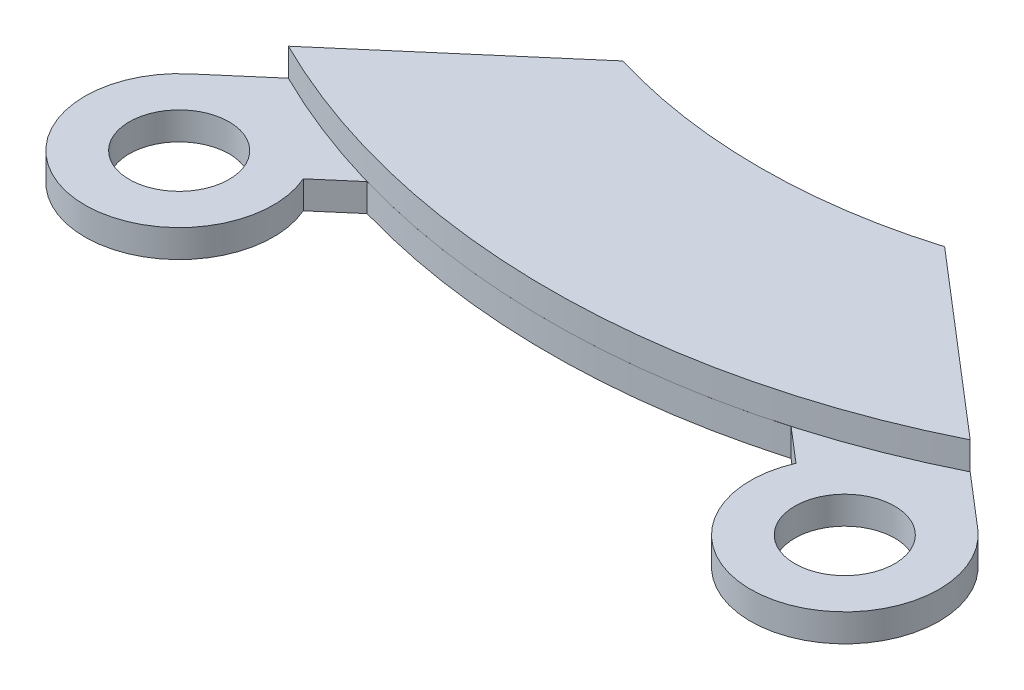
ISO-10303-21;
HEADER;
FILE_DESCRIPTION(('STEP AP214'),'2;1');
FILE_NAME('part.step','',(''),(''),'','','');
FILE_SCHEMA(('AUTOMOTIVE_DESIGN { 1 0 10303 214 1 1 1 1 }'));
ENDSEC;
DATA;
#1=APPLICATION_CONTEXT('core data for automotive mechanical design processes');
#2=APPLICATION_PROTOCOL_DEFINITION('international standard','automotive_design',2000,#1);
#3=PRODUCT_CONTEXT('',#1,'mechanical');
#4=PRODUCT('Part','Part','',(#3));
#5=PRODUCT_RELATED_PRODUCT_CATEGORY('part','',(#4));
#6=PRODUCT_DEFINITION_FORMATION('','',#4);
#7=PRODUCT_DEFINITION_CONTEXT('part definition',#1,'design');
#8=PRODUCT_DEFINITION('design','',#6,#7);
#9=PRODUCT_DEFINITION_SHAPE('','',#8);
#10=(LENGTH_UNIT() NAMED_UNIT(*) SI_UNIT(.MILLI.,.METRE.));
#11=(NAMED_UNIT(*) PLANE_ANGLE_UNIT() SI_UNIT($,.RADIAN.));
#12=(NAMED_UNIT(*) SI_UNIT($,.STERADIAN.) SOLID_ANGLE_UNIT());
#13=UNCERTAINTY_MEASURE_WITH_UNIT(LENGTH_MEASURE(1.E-05),#10,'distance_accuracy_value','');
#14=(GEOMETRIC_REPRESENTATION_CONTEXT(3) GLOBAL_UNCERTAINTY_ASSIGNED_CONTEXT((#13)) GLOBAL_UNIT_ASSIGNED_CONTEXT((#10,
#11,#12)) REPRESENTATION_CONTEXT('',''));
#15=CARTESIAN_POINT('',(0.,0.,0.));
#16=DIRECTION('',(0.,0.,1.));
#17=DIRECTION('',(1.,0.,0.));
#18=AXIS2_PLACEMENT_3D('',#15,#16,#17);
#19=CARTESIAN_POINT('',(0.,6.35,-91.886191982715));
#20=DIRECTION('',(0.,-1.,0.));
#21=DIRECTION('',(0.,0.,-1.));
#22=AXIS2_PLACEMENT_3D('',#19,#20,#21);
#23=CYLINDRICAL_SURFACE('',#22,63.5);
#24=CARTESIAN_POINT('',(0.,3.175,-91.886191982715));
#25=DIRECTION('',(0.,-1.,0.));
#26=DIRECTION('',(0.,0.,1.));
#27=AXIS2_PLACEMENT_3D('',#24,#25,#26);
#28=CIRCLE('',#27,63.5);
#29=CARTESIAN_POINT('',(18.415,3.175,-31.115));
#30=VERTEX_POINT('',#29);
#31=CARTESIAN_POINT('',(-18.415,3.175,-31.115));
#32=VERTEX_POINT('',#31);
#33=EDGE_CURVE('E105',#30,#32,#28,.T.);
#34=ORIENTED_EDGE('',*,*,#33,.T.);
#35=DIRECTION('',(0.,-1.,0.));
#36=VECTOR('',#35,1.);
#37=CARTESIAN_POINT('',(-18.415,6.35,-31.115));
#38=LINE('',#37,#36);
#39=CARTESIAN_POINT('',(-18.415,6.35,-31.115));
#40=VERTEX_POINT('',#39);
#41=EDGE_CURVE('E12',#40,#32,#38,.T.);
#42=ORIENTED_EDGE('',*,*,#41,.F.);
#43=CARTESIAN_POINT('',(0.,6.35,-91.886191982715));
#44=DIRECTION('',(0.,-1.,0.));
#45=DIRECTION('',(0.,0.,1.));
#46=AXIS2_PLACEMENT_3D('',#43,#44,#45);
#47=CIRCLE('',#46,63.5);
#48=CARTESIAN_POINT('',(18.415,6.35,-31.115));
#49=VERTEX_POINT('',#48);
#50=EDGE_CURVE('E93',#49,#40,#47,.T.);
#51=ORIENTED_EDGE('',*,*,#50,.F.);
#52=DIRECTION('',(0.,-1.,0.));
#53=VECTOR('',#52,1.);
#54=CARTESIAN_POINT('',(18.415,6.35,-31.115));
#55=LINE('',#54,#53);
#56=EDGE_CURVE('E101',#49,#30,#55,.T.);
#57=ORIENTED_EDGE('',*,*,#56,.T.);
#58=EDGE_LOOP('',(#34,#42,#51,#57));
#59=FACE_BOUND('',#58,.T.);
#60=ADVANCED_FACE('F42',(#59),#23,.F.);
#61=CARTESIAN_POINT('',(-18.415,6.35,-31.115));
#62=DIRECTION('',(0.651189073200743,0.,0.758915536106593));
#63=DIRECTION('',(0.758915536106593,0.,-0.651189073200743));
#64=AXIS2_PLACEMENT_3D('',#61,#62,#63);
#65=PLANE('',#64);
#66=DIRECTION('',(-0.758915536106592,0.,0.651189073200743));
#67=VECTOR('',#66,1.);
#68=CARTESIAN_POINT('',(-18.415,3.175,-31.115));
#69=LINE('',#68,#67);
#70=CARTESIAN_POINT('',(-39.0286573924199,3.175,-13.4274078846606));
#71=VERTEX_POINT('',#70);
#72=EDGE_CURVE('E97',#32,#71,#69,.T.);
#73=ORIENTED_EDGE('',*,*,#72,.T.);
#74=DIRECTION('',(0.,-1.,0.));
#75=VECTOR('',#74,1.);
#76=CARTESIAN_POINT('',(-39.0286573924199,6.35,-13.4274078846606));
#77=LINE('',#76,#75);
#78=CARTESIAN_POINT('',(-39.0286573924199,6.35,-13.4274078846606));
#79=VERTEX_POINT('',#78);
#80=EDGE_CURVE('E50',#79,#71,#77,.T.);
#81=ORIENTED_EDGE('',*,*,#80,.F.);
#82=DIRECTION('',(-0.758915536106592,0.,0.651189073200743));
#83=VECTOR('',#82,1.);
#84=CARTESIAN_POINT('',(-18.415,6.35,-31.115));
#85=LINE('',#84,#83);
#86=EDGE_CURVE('E88',#40,#79,#85,.T.);
#87=ORIENTED_EDGE('',*,*,#86,.F.);
#88=ORIENTED_EDGE('',*,*,#41,.T.);
#89=EDGE_LOOP('',(#73,#81,#87,#88));
#90=FACE_BOUND('',#89,.T.);
#91=ADVANCED_FACE('F96',(#90),#65,.F.);
#92=CARTESIAN_POINT('',(0.,6.35,-91.886191982715));
#93=DIRECTION('',(0.,-1.,0.));
#94=DIRECTION('',(0.,0.,-1.));
#95=AXIS2_PLACEMENT_3D('',#92,#93,#94);
#96=CYLINDRICAL_SURFACE('',#95,87.63);
#97=CARTESIAN_POINT('',(0.,3.175,-91.886191982715));
#98=DIRECTION('',(0.,1.,0.));
#99=DIRECTION('',(0.,0.,1.));
#100=AXIS2_PLACEMENT_3D('',#97,#98,#99);
#101=CIRCLE('',#100,87.63);
#102=CARTESIAN_POINT('',(39.0286573924199,3.175,-13.4274078846606));
#103=VERTEX_POINT('',#102);
#104=EDGE_CURVE('E75',#71,#103,#101,.T.);
#105=ORIENTED_EDGE('',*,*,#104,.T.);
#106=DIRECTION('',(0.,-1.,0.));
#107=VECTOR('',#106,1.);
#108=CARTESIAN_POINT('',(39.0286573924199,6.35,-13.4274078846606));
#109=LINE('',#108,#107);
#110=CARTESIAN_POINT('',(39.0286573924199,6.35,-13.4274078846606));
#111=VERTEX_POINT('',#110);
#112=EDGE_CURVE('E98',#111,#103,#109,.T.);
#113=ORIENTED_EDGE('',*,*,#112,.F.);
#114=CARTESIAN_POINT('',(0.,6.35,-91.886191982715));
#115=DIRECTION('',(0.,1.,0.));
#116=DIRECTION('',(0.,0.,1.));
#117=AXIS2_PLACEMENT_3D('',#114,#115,#116);
#118=CIRCLE('',#117,87.63);
#119=EDGE_CURVE('E91',#79,#111,#118,.T.);
#120=ORIENTED_EDGE('',*,*,#119,.F.);
#121=ORIENTED_EDGE('',*,*,#80,.T.);
#122=EDGE_LOOP('',(#105,#113,#120,#121));
#123=FACE_BOUND('',#122,.T.);
#124=ADVANCED_FACE('F99',(#123),#96,.T.);
#125=CARTESIAN_POINT('',(39.0286573924199,6.35,-13.4274078846606));
#126=DIRECTION('',(-0.651189073200743,0.,0.758915536106593));
#127=DIRECTION('',(0.758915536106593,0.,0.651189073200743));
#128=AXIS2_PLACEMENT_3D('',#125,#126,#127);
#129=PLANE('',#128);
#130=DIRECTION('',(-0.758915536106593,0.,-0.651189073200743));
#131=VECTOR('',#130,1.);
#132=CARTESIAN_POINT('',(39.0286573924199,3.175,-13.4274078846606));
#133=LINE('',#132,#131);
#134=EDGE_CURVE('E81',#103,#30,#133,.T.);
#135=ORIENTED_EDGE('',*,*,#134,.T.);
#136=ORIENTED_EDGE('',*,*,#56,.F.);
#137=DIRECTION('',(-0.758915536106593,0.,-0.651189073200743));
#138=VECTOR('',#137,1.);
#139=CARTESIAN_POINT('',(39.0286573924199,6.35,-13.4274078846606));
#140=LINE('',#139,#138);
#141=EDGE_CURVE('E58',#111,#49,#140,.T.);
#142=ORIENTED_EDGE('',*,*,#141,.F.);
#143=ORIENTED_EDGE('',*,*,#112,.T.);
#144=EDGE_LOOP('',(#135,#136,#142,#143));
#145=FACE_BOUND('',#144,.T.);
#146=ADVANCED_FACE('F112',(#145),#129,.F.);
#147=CARTESIAN_POINT('',(0.,6.35,-91.886191982715));
#148=DIRECTION('',(0.,1.,0.));
#149=DIRECTION('',(0.,0.,1.));
#150=AXIS2_PLACEMENT_3D('',#147,#148,#149);
#151=PLANE('',#150);
#152=ORIENTED_EDGE('',*,*,#50,.T.);
#153=ORIENTED_EDGE('',*,*,#86,.T.);
#154=ORIENTED_EDGE('',*,*,#119,.T.);
#155=ORIENTED_EDGE('',*,*,#141,.T.);
#156=EDGE_LOOP('',(#152,#153,#154,#155));
#157=FACE_BOUND('',#156,.T.);
#158=ADVANCED_FACE('F89',(#157),#151,.T.);
#159=CARTESIAN_POINT('',(0.,3.175,-91.886191982715));
#160=DIRECTION('',(0.,1.,0.));
#161=DIRECTION('',(0.,0.,1.));
#162=AXIS2_PLACEMENT_3D('',#159,#160,#161);
#163=PLANE('',#162);
#164=ORIENTED_EDGE('',*,*,#33,.F.);
#165=ORIENTED_EDGE('',*,*,#134,.F.);
#166=ORIENTED_EDGE('',*,*,#104,.F.);
#167=ORIENTED_EDGE('',*,*,#72,.F.);
#168=EDGE_LOOP('',(#164,#165,#166,#167));
#169=FACE_BOUND('',#168,.T.);
#170=ADVANCED_FACE('F115',(#169),#163,.F.);
#171=CLOSED_SHELL('',(#60,#91,#124,#146,#158,#170));
#172=MANIFOLD_SOLID_BREP('B2',#171);
#173=CARTESIAN_POINT('',(0.,3.175,-91.886191982715));
#174=DIRECTION('',(0.,1.,0.));
#175=DIRECTION('',(0.,0.,1.));
#176=AXIS2_PLACEMENT_3D('',#173,#174,#175);
#177=PLANE('',#176);
#178=CARTESIAN_POINT('',(38.1,3.175,0.));
#179=DIRECTION('',(0.,1.,0.));
#180=DIRECTION('',(0.,0.,1.));
#181=AXIS2_PLACEMENT_3D('',#178,#179,#180);
#182=CIRCLE('',#181,5.715);
#183=CARTESIAN_POINT('',(38.1,3.175,5.715));
#184=VERTEX_POINT('',#183);
#185=EDGE_CURVE('E266',#184,#184,#182,.T.);
#186=ORIENTED_EDGE('',*,*,#185,.F.);
#187=EDGE_LOOP('',(#186));
#188=FACE_BOUND('',#187,.T.);
#189=CARTESIAN_POINT('',(0.,3.175,-91.886191982715));
#190=DIRECTION('',(0.,1.,0.));
#191=DIRECTION('',(0.,0.,1.));
#192=AXIS2_PLACEMENT_3D('',#189,#190,#191);
#193=CIRCLE('',#192,87.63);
#194=CARTESIAN_POINT('',(-24.2692236551558,3.175,-7.6839254860462));
#195=VERTEX_POINT('',#194);
#196=CARTESIAN_POINT('',(24.2692236551558,3.175,-7.68392548604621));
#197=VERTEX_POINT('',#196);
#198=EDGE_CURVE('E277',#195,#197,#193,.T.);
#199=ORIENTED_EDGE('',*,*,#198,.T.);
#200=DIRECTION('',(0.758915536106591,0.,0.651189073200745));
#201=VECTOR('',#200,1.);
#202=CARTESIAN_POINT('',(28.2023418118575,3.175,-4.30910517285148));
#203=LINE('',#202,#201);
#204=CARTESIAN_POINT('',(28.2023418118575,3.175,-4.30910517285148));
#205=VERTEX_POINT('',#204);
#206=EDGE_CURVE('E225',#197,#205,#203,.T.);
#207=ORIENTED_EDGE('',*,*,#206,.T.);
#208=CARTESIAN_POINT('',(38.1,3.175,0.));
#209=DIRECTION('',(0.,1.,0.));
#210=DIRECTION('',(0.,0.,1.));
#211=AXIS2_PLACEMENT_3D('',#208,#209,#210);
#212=CIRCLE('',#211,10.795);
#213=CARTESIAN_POINT('',(45.129586045202,3.175,-8.19249321227067));
#214=VERTEX_POINT('',#213);
#215=EDGE_CURVE('E292',#205,#214,#212,.T.);
#216=ORIENTED_EDGE('',*,*,#215,.T.);
#217=DIRECTION('',(-0.758915536106593,0.,-0.651189073200743));
#218=VECTOR('',#217,1.);
#219=CARTESIAN_POINT('',(45.129586045202,3.175,-8.19249321227067));
#220=LINE('',#219,#218);
#221=CARTESIAN_POINT('',(18.415,3.175,-31.115));
#222=VERTEX_POINT('',#221);
#223=EDGE_CURVE('E305',#214,#222,#220,.T.);
#224=ORIENTED_EDGE('',*,*,#223,.T.);
#225=CARTESIAN_POINT('',(0.,3.175,-91.886191982715));
#226=DIRECTION('',(0.,-1.,0.));
#227=DIRECTION('',(0.,0.,1.));
#228=AXIS2_PLACEMENT_3D('',#225,#226,#227);
#229=CIRCLE('',#228,63.5);
#230=CARTESIAN_POINT('',(-18.415,3.175,-31.115));
#231=VERTEX_POINT('',#230);
#232=EDGE_CURVE('E244',#222,#231,#229,.T.);
#233=ORIENTED_EDGE('',*,*,#232,.T.);
#234=DIRECTION('',(-0.758915536106593,0.,0.651189073200743));
#235=VECTOR('',#234,1.);
#236=CARTESIAN_POINT('',(-45.129586045202,3.175,-8.19249321227066));
#237=LINE('',#236,#235);
#238=CARTESIAN_POINT('',(-45.129586045202,3.175,-8.19249321227066));
#239=VERTEX_POINT('',#238);
#240=EDGE_CURVE('E238',#231,#239,#237,.T.);
#241=ORIENTED_EDGE('',*,*,#240,.T.);
#242=CARTESIAN_POINT('',(-38.1,3.175,0.));
#243=DIRECTION('',(0.,1.,0.));
#244=DIRECTION('',(0.,0.,-1.));
#245=AXIS2_PLACEMENT_3D('',#242,#243,#244);
#246=CIRCLE('',#245,10.795);
#247=CARTESIAN_POINT('',(-28.2023418118575,3.175,-4.30910517285147));
#248=VERTEX_POINT('',#247);
#249=EDGE_CURVE('E242',#239,#248,#246,.T.);
#250=ORIENTED_EDGE('',*,*,#249,.T.);
#251=DIRECTION('',(0.758915536106591,0.,-0.651189073200745));
#252=VECTOR('',#251,1.);
#253=CARTESIAN_POINT('',(-28.2023418118575,3.175,-4.30910517285147));
#254=LINE('',#253,#252);
#255=EDGE_CURVE('E182',#248,#195,#254,.T.);
#256=ORIENTED_EDGE('',*,*,#255,.T.);
#257=EDGE_LOOP('',(#199,#207,#216,#224,#233,#241,#250,#256));
#258=FACE_BOUND('',#257,.T.);
#259=CARTESIAN_POINT('',(-38.1,3.175,0.));
#260=DIRECTION('',(0.,1.,0.));
#261=DIRECTION('',(0.,0.,-1.));
#262=AXIS2_PLACEMENT_3D('',#259,#260,#261);
#263=CIRCLE('',#262,5.715);
#264=CARTESIAN_POINT('',(-38.1,3.175,-5.71499999999999));
#265=VERTEX_POINT('',#264);
#266=EDGE_CURVE('E314',#265,#265,#263,.T.);
#267=ORIENTED_EDGE('',*,*,#266,.F.);
#268=EDGE_LOOP('',(#267));
#269=FACE_BOUND('',#268,.T.);
#270=ADVANCED_FACE('F165',(#188,#258,#269),#177,.T.);
#271=CARTESIAN_POINT('',(0.,0.,-91.886191982715));
#272=DIRECTION('',(0.,1.,0.));
#273=DIRECTION('',(0.,0.,1.));
#274=AXIS2_PLACEMENT_3D('',#271,#272,#273);
#275=PLANE('',#274);
#276=CARTESIAN_POINT('',(0.,0.,-91.886191982715));
#277=DIRECTION('',(0.,1.,0.));
#278=DIRECTION('',(0.,0.,1.));
#279=AXIS2_PLACEMENT_3D('',#276,#277,#278);
#280=CIRCLE('',#279,87.63);
#281=CARTESIAN_POINT('',(-24.2692236551558,0.,-7.6839254860462));
#282=VERTEX_POINT('',#281);
#283=CARTESIAN_POINT('',(24.2692236551558,0.,-7.68392548604621));
#284=VERTEX_POINT('',#283);
#285=EDGE_CURVE('E262',#282,#284,#280,.T.);
#286=ORIENTED_EDGE('',*,*,#285,.F.);
#287=DIRECTION('',(0.758915536106591,0.,-0.651189073200745));
#288=VECTOR('',#287,1.);
#289=CARTESIAN_POINT('',(-28.2023418118575,0.,-4.30910517285147));
#290=LINE('',#289,#288);
#291=CARTESIAN_POINT('',(-28.2023418118575,0.,-4.30910517285147));
#292=VERTEX_POINT('',#291);
#293=EDGE_CURVE('E217',#292,#282,#290,.T.);
#294=ORIENTED_EDGE('',*,*,#293,.F.);
#295=CARTESIAN_POINT('',(-38.1,0.,0.));
#296=DIRECTION('',(0.,1.,0.));
#297=DIRECTION('',(0.,0.,-1.));
#298=AXIS2_PLACEMENT_3D('',#295,#296,#297);
#299=CIRCLE('',#298,10.795);
#300=CARTESIAN_POINT('',(-45.129586045202,0.,-8.19249321227066));
#301=VERTEX_POINT('',#300);
#302=EDGE_CURVE('E211',#301,#292,#299,.T.);
#303=ORIENTED_EDGE('',*,*,#302,.F.);
#304=DIRECTION('',(-0.758915536106593,0.,0.651189073200743));
#305=VECTOR('',#304,1.);
#306=CARTESIAN_POINT('',(-45.129586045202,0.,-8.19249321227066));
#307=LINE('',#306,#305);
#308=CARTESIAN_POINT('',(-18.415,0.,-31.115));
#309=VERTEX_POINT('',#308);
#310=EDGE_CURVE('E252',#309,#301,#307,.T.);
#311=ORIENTED_EDGE('',*,*,#310,.F.);
#312=CARTESIAN_POINT('',(0.,0.,-91.886191982715));
#313=DIRECTION('',(0.,-1.,0.));
#314=DIRECTION('',(0.,0.,1.));
#315=AXIS2_PLACEMENT_3D('',#312,#313,#314);
#316=CIRCLE('',#315,63.5);
#317=CARTESIAN_POINT('',(18.415,0.,-31.115));
#318=VERTEX_POINT('',#317);
#319=EDGE_CURVE('E272',#318,#309,#316,.T.);
#320=ORIENTED_EDGE('',*,*,#319,.F.);
#321=DIRECTION('',(-0.758915536106593,0.,-0.651189073200743));
#322=VECTOR('',#321,1.);
#323=CARTESIAN_POINT('',(45.129586045202,0.,-8.19249321227067));
#324=LINE('',#323,#322);
#325=CARTESIAN_POINT('',(45.129586045202,0.,-8.19249321227067));
#326=VERTEX_POINT('',#325);
#327=EDGE_CURVE('E270',#326,#318,#324,.T.);
#328=ORIENTED_EDGE('',*,*,#327,.F.);
#329=CARTESIAN_POINT('',(38.1,0.,0.));
#330=DIRECTION('',(0.,1.,0.));
#331=DIRECTION('',(0.,0.,1.));
#332=AXIS2_PLACEMENT_3D('',#329,#330,#331);
#333=CIRCLE('',#332,10.795);
#334=CARTESIAN_POINT('',(28.2023418118575,0.,-4.30910517285148));
#335=VERTEX_POINT('',#334);
#336=EDGE_CURVE('E268',#335,#326,#333,.T.);
#337=ORIENTED_EDGE('',*,*,#336,.F.);
#338=DIRECTION('',(0.758915536106591,0.,0.651189073200745));
#339=VECTOR('',#338,1.);
#340=CARTESIAN_POINT('',(28.2023418118575,0.,-4.30910517285148));
#341=LINE('',#340,#339);
#342=EDGE_CURVE('E265',#284,#335,#341,.T.);
#343=ORIENTED_EDGE('',*,*,#342,.F.);
#344=EDGE_LOOP('',(#286,#294,#303,#311,#320,#328,#337,#343));
#345=FACE_BOUND('',#344,.T.);
#346=CARTESIAN_POINT('',(38.1,0.,0.));
#347=DIRECTION('',(0.,1.,0.));
#348=DIRECTION('',(0.,0.,1.));
#349=AXIS2_PLACEMENT_3D('',#346,#347,#348);
#350=CIRCLE('',#349,5.715);
#351=CARTESIAN_POINT('',(38.1,0.,5.715));
#352=VERTEX_POINT('',#351);
#353=EDGE_CURVE('E311',#352,#352,#350,.T.);
#354=ORIENTED_EDGE('',*,*,#353,.T.);
#355=EDGE_LOOP('',(#354));
#356=FACE_BOUND('',#355,.T.);
#357=CARTESIAN_POINT('',(-38.1,0.,0.));
#358=DIRECTION('',(0.,1.,0.));
#359=DIRECTION('',(0.,0.,-1.));
#360=AXIS2_PLACEMENT_3D('',#357,#358,#359);
#361=CIRCLE('',#360,5.715);
#362=CARTESIAN_POINT('',(-38.1,0.,-5.71499999999999));
#363=VERTEX_POINT('',#362);
#364=EDGE_CURVE('E317',#363,#363,#361,.T.);
#365=ORIENTED_EDGE('',*,*,#364,.T.);
#366=EDGE_LOOP('',(#365));
#367=FACE_BOUND('',#366,.T.);
#368=ADVANCED_FACE('F296',(#345,#356,#367),#275,.F.);
#369=CARTESIAN_POINT('',(0.,3.175,-91.886191982715));
#370=DIRECTION('',(0.,-1.,0.));
#371=DIRECTION('',(0.,0.,-1.));
#372=AXIS2_PLACEMENT_3D('',#369,#370,#371);
#373=CYLINDRICAL_SURFACE('',#372,87.63);
#374=ORIENTED_EDGE('',*,*,#285,.T.);
#375=DIRECTION('',(0.,-1.,0.));
#376=VECTOR('',#375,1.);
#377=CARTESIAN_POINT('',(24.2692236551558,3.175,-7.68392548604621));
#378=LINE('',#377,#376);
#379=EDGE_CURVE('E40',#197,#284,#378,.T.);
#380=ORIENTED_EDGE('',*,*,#379,.F.);
#381=ORIENTED_EDGE('',*,*,#198,.F.);
#382=DIRECTION('',(0.,-1.,0.));
#383=VECTOR('',#382,1.);
#384=CARTESIAN_POINT('',(-24.2692236551558,3.175,-7.6839254860462));
#385=LINE('',#384,#383);
#386=EDGE_CURVE('E258',#195,#282,#385,.T.);
#387=ORIENTED_EDGE('',*,*,#386,.T.);
#388=EDGE_LOOP('',(#374,#380,#381,#387));
#389=FACE_BOUND('',#388,.T.);
#390=ADVANCED_FACE('F167',(#389),#373,.T.);
#391=CARTESIAN_POINT('',(28.2023418118575,3.175,-4.30910517285148));
#392=DIRECTION('',(0.651189073200745,0.,-0.758915536106591));
#393=DIRECTION('',(-0.758915536106592,0.,-0.651189073200745));
#394=AXIS2_PLACEMENT_3D('',#391,#392,#393);
#395=PLANE('',#394);
#396=ORIENTED_EDGE('',*,*,#342,.T.);
#397=DIRECTION('',(0.,-1.,0.));
#398=VECTOR('',#397,1.);
#399=CARTESIAN_POINT('',(28.2023418118575,3.175,-4.30910517285148));
#400=LINE('',#399,#398);
#401=EDGE_CURVE('E174',#205,#335,#400,.T.);
#402=ORIENTED_EDGE('',*,*,#401,.F.);
#403=ORIENTED_EDGE('',*,*,#206,.F.);
#404=ORIENTED_EDGE('',*,*,#379,.T.);
#405=EDGE_LOOP('',(#396,#402,#403,#404));
#406=FACE_BOUND('',#405,.T.);
#407=ADVANCED_FACE('F349',(#406),#395,.F.);
#408=CARTESIAN_POINT('',(38.1,3.175,0.));
#409=DIRECTION('',(0.,-1.,0.));
#410=DIRECTION('',(0.,0.,-1.));
#411=AXIS2_PLACEMENT_3D('',#408,#409,#410);
#412=CYLINDRICAL_SURFACE('',#411,10.795);
#413=ORIENTED_EDGE('',*,*,#336,.T.);
#414=DIRECTION('',(0.,-1.,0.));
#415=VECTOR('',#414,1.);
#416=CARTESIAN_POINT('',(45.129586045202,3.175,-8.19249321227067));
#417=LINE('',#416,#415);
#418=EDGE_CURVE('E284',#214,#326,#417,.T.);
#419=ORIENTED_EDGE('',*,*,#418,.F.);
#420=ORIENTED_EDGE('',*,*,#215,.F.);
#421=ORIENTED_EDGE('',*,*,#401,.T.);
#422=EDGE_LOOP('',(#413,#419,#420,#421));
#423=FACE_BOUND('',#422,.T.);
#424=ADVANCED_FACE('F290',(#423),#412,.T.);
#425=CARTESIAN_POINT('',(45.129586045202,3.175,-8.19249321227067));
#426=DIRECTION('',(-0.651189073200743,0.,0.758915536106593));
#427=DIRECTION('',(0.758915536106593,0.,0.651189073200743));
#428=AXIS2_PLACEMENT_3D('',#425,#426,#427);
#429=PLANE('',#428);
#430=ORIENTED_EDGE('',*,*,#327,.T.);
#431=DIRECTION('',(0.,-1.,0.));
#432=VECTOR('',#431,1.);
#433=CARTESIAN_POINT('',(18.415,3.175,-31.115));
#434=LINE('',#433,#432);
#435=EDGE_CURVE('E281',#222,#318,#434,.T.);
#436=ORIENTED_EDGE('',*,*,#435,.F.);
#437=ORIENTED_EDGE('',*,*,#223,.F.);
#438=ORIENTED_EDGE('',*,*,#418,.T.);
#439=EDGE_LOOP('',(#430,#436,#437,#438));
#440=FACE_BOUND('',#439,.T.);
#441=ADVANCED_FACE('F301',(#440),#429,.F.);
#442=CARTESIAN_POINT('',(0.,3.175,-91.886191982715));
#443=DIRECTION('',(0.,-1.,0.));
#444=DIRECTION('',(0.,0.,-1.));
#445=AXIS2_PLACEMENT_3D('',#442,#443,#444);
#446=CYLINDRICAL_SURFACE('',#445,63.5);
#447=ORIENTED_EDGE('',*,*,#319,.T.);
#448=DIRECTION('',(0.,-1.,0.));
#449=VECTOR('',#448,1.);
#450=CARTESIAN_POINT('',(-18.415,3.175,-31.115));
#451=LINE('',#450,#449);
#452=EDGE_CURVE('E253',#231,#309,#451,.T.);
#453=ORIENTED_EDGE('',*,*,#452,.F.);
#454=ORIENTED_EDGE('',*,*,#232,.F.);
#455=ORIENTED_EDGE('',*,*,#435,.T.);
#456=EDGE_LOOP('',(#447,#453,#454,#455));
#457=FACE_BOUND('',#456,.T.);
#458=ADVANCED_FACE('F304',(#457),#446,.F.);
#459=CARTESIAN_POINT('',(-45.129586045202,3.175,-8.19249321227066));
#460=DIRECTION('',(0.651189073200743,0.,0.758915536106593));
#461=DIRECTION('',(0.758915536106593,0.,-0.651189073200743));
#462=AXIS2_PLACEMENT_3D('',#459,#460,#461);
#463=PLANE('',#462);
#464=ORIENTED_EDGE('',*,*,#310,.T.);
#465=DIRECTION('',(0.,-1.,0.));
#466=VECTOR('',#465,1.);
#467=CARTESIAN_POINT('',(-45.129586045202,3.175,-8.19249321227066));
#468=LINE('',#467,#466);
#469=EDGE_CURVE('E249',#239,#301,#468,.T.);
#470=ORIENTED_EDGE('',*,*,#469,.F.);
#471=ORIENTED_EDGE('',*,*,#240,.F.);
#472=ORIENTED_EDGE('',*,*,#452,.T.);
#473=EDGE_LOOP('',(#464,#470,#471,#472));
#474=FACE_BOUND('',#473,.T.);
#475=ADVANCED_FACE('F250',(#474),#463,.F.);
#476=CARTESIAN_POINT('',(-38.1,3.175,0.));
#477=DIRECTION('',(0.,-1.,0.));
#478=DIRECTION('',(0.,0.,-1.));
#479=AXIS2_PLACEMENT_3D('',#476,#477,#478);
#480=CYLINDRICAL_SURFACE('',#479,10.795);
#481=ORIENTED_EDGE('',*,*,#302,.T.);
#482=DIRECTION('',(0.,-1.,0.));
#483=VECTOR('',#482,1.);
#484=CARTESIAN_POINT('',(-28.2023418118575,3.175,-4.30910517285147));
#485=LINE('',#484,#483);
#486=EDGE_CURVE('E254',#248,#292,#485,.T.);
#487=ORIENTED_EDGE('',*,*,#486,.F.);
#488=ORIENTED_EDGE('',*,*,#249,.F.);
#489=ORIENTED_EDGE('',*,*,#469,.T.);
#490=EDGE_LOOP('',(#481,#487,#488,#489));
#491=FACE_BOUND('',#490,.T.);
#492=ADVANCED_FACE('F256',(#491),#480,.T.);
#493=CARTESIAN_POINT('',(-28.2023418118575,3.175,-4.30910517285147));
#494=DIRECTION('',(-0.651189073200745,0.,-0.758915536106591));
#495=DIRECTION('',(-0.758915536106591,0.,0.651189073200745));
#496=AXIS2_PLACEMENT_3D('',#493,#494,#495);
#497=PLANE('',#496);
#498=ORIENTED_EDGE('',*,*,#293,.T.);
#499=ORIENTED_EDGE('',*,*,#386,.F.);
#500=ORIENTED_EDGE('',*,*,#255,.F.);
#501=ORIENTED_EDGE('',*,*,#486,.T.);
#502=EDGE_LOOP('',(#498,#499,#500,#501));
#503=FACE_BOUND('',#502,.T.);
#504=ADVANCED_FACE('F337',(#503),#497,.F.);
#505=CARTESIAN_POINT('',(38.1,3.175,0.));
#506=DIRECTION('',(0.,-1.,0.));
#507=DIRECTION('',(0.,0.,-1.));
#508=AXIS2_PLACEMENT_3D('',#505,#506,#507);
#509=CYLINDRICAL_SURFACE('',#508,5.715);
#510=ORIENTED_EDGE('',*,*,#185,.T.);
#511=EDGE_LOOP('',(#510));
#512=FACE_BOUND('',#511,.T.);
#513=ORIENTED_EDGE('',*,*,#353,.F.);
#514=EDGE_LOOP('',(#513));
#515=FACE_BOUND('',#514,.T.);
#516=ADVANCED_FACE('F334',(#512,#515),#509,.F.);
#517=CARTESIAN_POINT('',(-38.1,3.175,0.));
#518=DIRECTION('',(0.,-1.,0.));
#519=DIRECTION('',(0.,0.,-1.));
#520=AXIS2_PLACEMENT_3D('',#517,#518,#519);
#521=CYLINDRICAL_SURFACE('',#520,5.715);
#522=ORIENTED_EDGE('',*,*,#266,.T.);
#523=EDGE_LOOP('',(#522));
#524=FACE_BOUND('',#523,.T.);
#525=ORIENTED_EDGE('',*,*,#364,.F.);
#526=EDGE_LOOP('',(#525));
#527=FACE_BOUND('',#526,.T.);
#528=ADVANCED_FACE('F323',(#524,#527),#521,.F.);
#529=CLOSED_SHELL('',(#270,#368,#390,#407,#424,#441,#458,#475,#492,#504,#516,#528));
#530=MANIFOLD_SOLID_BREP('B6',#529);
#531=ADVANCED_BREP_SHAPE_REPRESENTATION('',(#18,#172,#530),#14);
#532=SHAPE_DEFINITION_REPRESENTATION(#9,#531);
ENDSEC;
END-ISO-10303-21;
